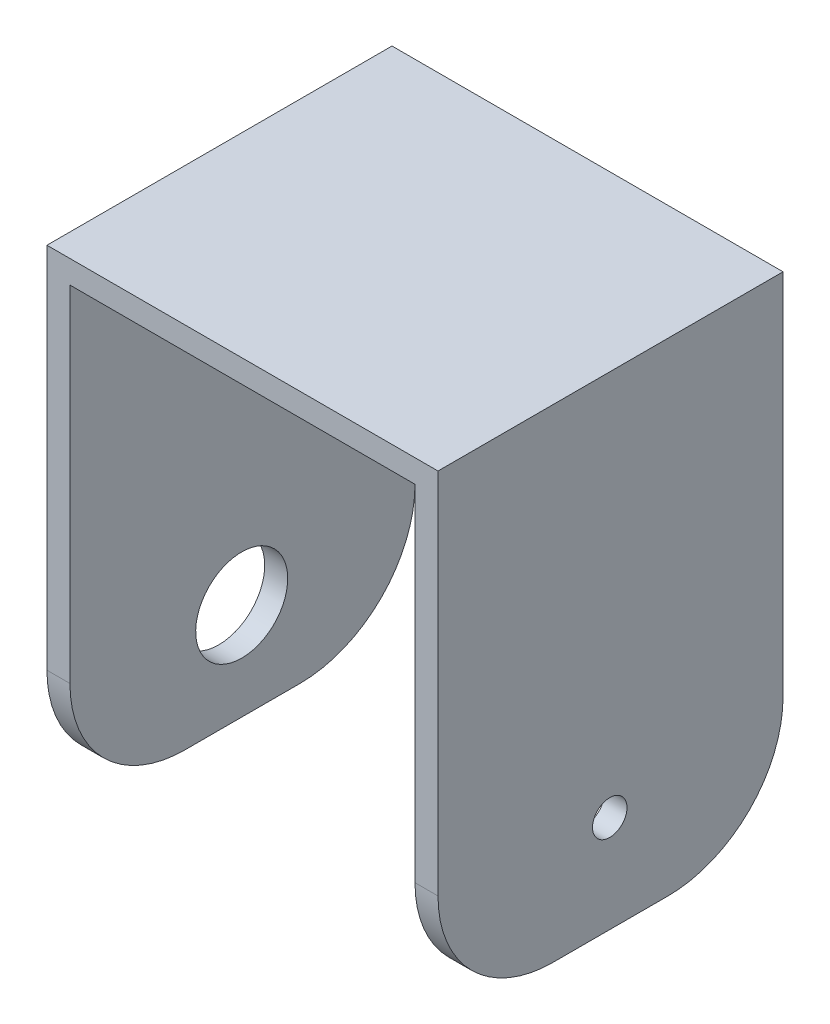
ISO-10303-21;
HEADER;
FILE_DESCRIPTION(('STEP AP214'),'2;1');
FILE_NAME('part.step','',(''),(''),'','','');
FILE_SCHEMA(('AUTOMOTIVE_DESIGN { 1 0 10303 214 1 1 1 1 }'));
ENDSEC;
DATA;
#1=APPLICATION_CONTEXT('core data for automotive mechanical design processes');
#2=APPLICATION_PROTOCOL_DEFINITION('international standard','automotive_design',2000,#1);
#3=PRODUCT_CONTEXT('',#1,'mechanical');
#4=PRODUCT('Part','Part','',(#3));
#5=PRODUCT_RELATED_PRODUCT_CATEGORY('part','',(#4));
#6=PRODUCT_DEFINITION_FORMATION('','',#4);
#7=PRODUCT_DEFINITION_CONTEXT('part definition',#1,'design');
#8=PRODUCT_DEFINITION('design','',#6,#7);
#9=PRODUCT_DEFINITION_SHAPE('','',#8);
#10=(LENGTH_UNIT() NAMED_UNIT(*) SI_UNIT(.MILLI.,.METRE.));
#11=(NAMED_UNIT(*) PLANE_ANGLE_UNIT() SI_UNIT($,.RADIAN.));
#12=(NAMED_UNIT(*) SI_UNIT($,.STERADIAN.) SOLID_ANGLE_UNIT());
#13=UNCERTAINTY_MEASURE_WITH_UNIT(LENGTH_MEASURE(1.E-05),#10,'distance_accuracy_value','');
#14=(GEOMETRIC_REPRESENTATION_CONTEXT(3) GLOBAL_UNCERTAINTY_ASSIGNED_CONTEXT((#13)) GLOBAL_UNIT_ASSIGNED_CONTEXT((#10,
#11,#12)) REPRESENTATION_CONTEXT('',''));
#15=CARTESIAN_POINT('',(0.,0.,0.));
#16=DIRECTION('',(0.,0.,1.));
#17=DIRECTION('',(1.,0.,0.));
#18=AXIS2_PLACEMENT_3D('',#15,#16,#17);
#19=CARTESIAN_POINT('',(0.,0.,30.));
#20=DIRECTION('',(0.,1.,0.));
#21=DIRECTION('',(0.,0.,1.));
#22=AXIS2_PLACEMENT_3D('',#19,#20,#21);
#23=PLANE('',#22);
#24=DIRECTION('',(0.,0.,-1.));
#25=VECTOR('',#24,1.);
#26=CARTESIAN_POINT('',(2.,0.,30.));
#27=LINE('',#26,#25);
#28=CARTESIAN_POINT('',(2.,0.,20.));
#29=VERTEX_POINT('',#28);
#30=CARTESIAN_POINT('',(2.,0.,10.));
#31=VERTEX_POINT('',#30);
#32=EDGE_CURVE('E147',#29,#31,#27,.T.);
#33=ORIENTED_EDGE('',*,*,#32,.F.);
#34=DIRECTION('',(1.,0.,0.));
#35=VECTOR('',#34,1.);
#36=CARTESIAN_POINT('',(0.,0.,20.));
#37=LINE('',#36,#35);
#38=CARTESIAN_POINT('',(0.,0.,20.));
#39=VERTEX_POINT('',#38);
#40=EDGE_CURVE('E219',#29,#39,#37,.F.);
#41=ORIENTED_EDGE('',*,*,#40,.T.);
#42=DIRECTION('',(0.,0.,-1.));
#43=VECTOR('',#42,1.);
#44=CARTESIAN_POINT('',(0.,0.,30.));
#45=LINE('',#44,#43);
#46=CARTESIAN_POINT('',(0.,0.,10.));
#47=VERTEX_POINT('',#46);
#48=EDGE_CURVE('E170',#39,#47,#45,.T.);
#49=ORIENTED_EDGE('',*,*,#48,.T.);
#50=DIRECTION('',(1.,0.,0.));
#51=VECTOR('',#50,1.);
#52=CARTESIAN_POINT('',(0.,0.,10.));
#53=LINE('',#52,#51);
#54=EDGE_CURVE('E220',#47,#31,#53,.T.);
#55=ORIENTED_EDGE('',*,*,#54,.T.);
#56=EDGE_LOOP('',(#33,#41,#49,#55));
#57=FACE_BOUND('',#56,.T.);
#58=ADVANCED_FACE('F39',(#57),#23,.F.);
#59=CARTESIAN_POINT('',(2.,0.,30.));
#60=DIRECTION('',(-1.,0.,0.));
#61=DIRECTION('',(0.,0.,1.));
#62=AXIS2_PLACEMENT_3D('',#59,#60,#61);
#63=PLANE('',#62);
#64=CARTESIAN_POINT('',(2.,8.44012340517832,15.0664421294036));
#65=DIRECTION('',(1.,0.,0.));
#66=DIRECTION('',(0.,0.,-1.));
#67=AXIS2_PLACEMENT_3D('',#64,#65,#66);
#68=CIRCLE('',#67,1.50000000000072);
#69=CARTESIAN_POINT('',(2.,8.44012340517832,13.5664421294028));
#70=VERTEX_POINT('',#69);
#71=EDGE_CURVE('E232',#70,#70,#68,.T.);
#72=ORIENTED_EDGE('',*,*,#71,.F.);
#73=EDGE_LOOP('',(#72));
#74=FACE_BOUND('',#73,.T.);
#75=DIRECTION('',(0.,1.,0.));
#76=VECTOR('',#75,1.);
#77=CARTESIAN_POINT('',(2.,0.,30.));
#78=LINE('',#77,#76);
#79=CARTESIAN_POINT('',(2.,10.,30.));
#80=VERTEX_POINT('',#79);
#81=CARTESIAN_POINT('',(2.,42.,30.));
#82=VERTEX_POINT('',#81);
#83=EDGE_CURVE('E134',#80,#82,#78,.T.);
#84=ORIENTED_EDGE('',*,*,#83,.F.);
#85=CARTESIAN_POINT('',(2.,10.,20.));
#86=DIRECTION('',(-1.,0.,0.));
#87=DIRECTION('',(0.,0.,1.));
#88=AXIS2_PLACEMENT_3D('',#85,#86,#87);
#89=CIRCLE('',#88,10.);
#90=EDGE_CURVE('E214',#80,#29,#89,.F.);
#91=ORIENTED_EDGE('',*,*,#90,.T.);
#92=ORIENTED_EDGE('',*,*,#32,.T.);
#93=CARTESIAN_POINT('',(2.,10.,10.));
#94=DIRECTION('',(-1.,0.,0.));
#95=DIRECTION('',(0.,0.,1.));
#96=AXIS2_PLACEMENT_3D('',#93,#94,#95);
#97=CIRCLE('',#96,10.);
#98=CARTESIAN_POINT('',(2.,10.,0.));
#99=VERTEX_POINT('',#98);
#100=EDGE_CURVE('E213',#31,#99,#97,.F.);
#101=ORIENTED_EDGE('',*,*,#100,.T.);
#102=DIRECTION('',(0.,1.,0.));
#103=VECTOR('',#102,1.);
#104=CARTESIAN_POINT('',(2.,0.,0.));
#105=LINE('',#104,#103);
#106=CARTESIAN_POINT('',(2.,42.,0.));
#107=VERTEX_POINT('',#106);
#108=EDGE_CURVE('E150',#99,#107,#105,.T.);
#109=ORIENTED_EDGE('',*,*,#108,.T.);
#110=DIRECTION('',(0.,0.,-1.));
#111=VECTOR('',#110,1.);
#112=CARTESIAN_POINT('',(2.,42.,30.));
#113=LINE('',#112,#111);
#114=EDGE_CURVE('E144',#82,#107,#113,.T.);
#115=ORIENTED_EDGE('',*,*,#114,.F.);
#116=EDGE_LOOP('',(#84,#91,#92,#101,#109,#115));
#117=FACE_BOUND('',#116,.T.);
#118=ADVANCED_FACE('F148',(#74,#117),#63,.F.);
#119=CARTESIAN_POINT('',(2.,42.,30.));
#120=DIRECTION('',(0.,-1.,0.));
#121=DIRECTION('',(1.,0.,0.));
#122=AXIS2_PLACEMENT_3D('',#119,#120,#121);
#123=PLANE('',#122);
#124=DIRECTION('',(-1.,0.,0.));
#125=VECTOR('',#124,1.);
#126=CARTESIAN_POINT('',(2.,42.,0.));
#127=LINE('',#126,#125);
#128=CARTESIAN_POINT('',(-32.,42.,0.));
#129=VERTEX_POINT('',#128);
#130=EDGE_CURVE('E166',#107,#129,#127,.T.);
#131=ORIENTED_EDGE('',*,*,#130,.T.);
#132=DIRECTION('',(0.,0.,-1.));
#133=VECTOR('',#132,1.);
#134=CARTESIAN_POINT('',(-32.,42.,30.));
#135=LINE('',#134,#133);
#136=CARTESIAN_POINT('',(-32.,42.,30.));
#137=VERTEX_POINT('',#136);
#138=EDGE_CURVE('E151',#137,#129,#135,.T.);
#139=ORIENTED_EDGE('',*,*,#138,.F.);
#140=DIRECTION('',(-1.,0.,0.));
#141=VECTOR('',#140,1.);
#142=CARTESIAN_POINT('',(2.,42.,30.));
#143=LINE('',#142,#141);
#144=EDGE_CURVE('E138',#82,#137,#143,.T.);
#145=ORIENTED_EDGE('',*,*,#144,.F.);
#146=ORIENTED_EDGE('',*,*,#114,.T.);
#147=EDGE_LOOP('',(#131,#139,#145,#146));
#148=FACE_BOUND('',#147,.T.);
#149=ADVANCED_FACE('F153',(#148),#123,.F.);
#150=CARTESIAN_POINT('',(-32.,42.,30.));
#151=DIRECTION('',(1.,0.,0.));
#152=DIRECTION('',(0.,1.,0.));
#153=AXIS2_PLACEMENT_3D('',#150,#151,#152);
#154=PLANE('',#153);
#155=CARTESIAN_POINT('',(-32.,8.44012340517832,15.0664421294036));
#156=DIRECTION('',(-1.,0.,0.));
#157=DIRECTION('',(0.,-1.,0.));
#158=AXIS2_PLACEMENT_3D('',#155,#156,#157);
#159=CIRCLE('',#158,4.);
#160=CARTESIAN_POINT('',(-32.,4.44012340517832,15.0664421294036));
#161=VERTEX_POINT('',#160);
#162=EDGE_CURVE('E229',#161,#161,#159,.T.);
#163=ORIENTED_EDGE('',*,*,#162,.F.);
#164=EDGE_LOOP('',(#163));
#165=FACE_BOUND('',#164,.T.);
#166=DIRECTION('',(0.,0.,-1.));
#167=VECTOR('',#166,1.);
#168=CARTESIAN_POINT('',(-32.,0.,30.));
#169=LINE('',#168,#167);
#170=CARTESIAN_POINT('',(-32.,0.,20.));
#171=VERTEX_POINT('',#170);
#172=CARTESIAN_POINT('',(-32.,0.,10.));
#173=VERTEX_POINT('',#172);
#174=EDGE_CURVE('E187',#171,#173,#169,.T.);
#175=ORIENTED_EDGE('',*,*,#174,.F.);
#176=CARTESIAN_POINT('',(-32.,9.99999999999999,20.));
#177=DIRECTION('',(1.,0.,0.));
#178=DIRECTION('',(0.,1.,0.));
#179=AXIS2_PLACEMENT_3D('',#176,#177,#178);
#180=CIRCLE('',#179,10.);
#181=CARTESIAN_POINT('',(-32.,10.,30.));
#182=VERTEX_POINT('',#181);
#183=EDGE_CURVE('E211',#171,#182,#180,.F.);
#184=ORIENTED_EDGE('',*,*,#183,.T.);
#185=DIRECTION('',(0.,-1.,0.));
#186=VECTOR('',#185,1.);
#187=CARTESIAN_POINT('',(-32.,42.,30.));
#188=LINE('',#187,#186);
#189=EDGE_CURVE('E156',#137,#182,#188,.T.);
#190=ORIENTED_EDGE('',*,*,#189,.F.);
#191=ORIENTED_EDGE('',*,*,#138,.T.);
#192=DIRECTION('',(0.,-1.,0.));
#193=VECTOR('',#192,1.);
#194=CARTESIAN_POINT('',(-32.,42.,0.));
#195=LINE('',#194,#193);
#196=CARTESIAN_POINT('',(-32.,10.,0.));
#197=VERTEX_POINT('',#196);
#198=EDGE_CURVE('E171',#129,#197,#195,.T.);
#199=ORIENTED_EDGE('',*,*,#198,.T.);
#200=CARTESIAN_POINT('',(-32.,9.99999999999999,10.));
#201=DIRECTION('',(1.,0.,0.));
#202=DIRECTION('',(0.,1.,0.));
#203=AXIS2_PLACEMENT_3D('',#200,#201,#202);
#204=CIRCLE('',#203,10.);
#205=EDGE_CURVE('E207',#197,#173,#204,.F.);
#206=ORIENTED_EDGE('',*,*,#205,.T.);
#207=EDGE_LOOP('',(#175,#184,#190,#191,#199,#206));
#208=FACE_BOUND('',#207,.T.);
#209=ADVANCED_FACE('F247',(#165,#208),#154,.F.);
#210=CARTESIAN_POINT('',(-32.,0.,30.));
#211=DIRECTION('',(0.,1.,0.));
#212=DIRECTION('',(0.,0.,1.));
#213=AXIS2_PLACEMENT_3D('',#210,#211,#212);
#214=PLANE('',#213);
#215=DIRECTION('',(0.,0.,-1.));
#216=VECTOR('',#215,1.);
#217=CARTESIAN_POINT('',(-30.,0.,30.));
#218=LINE('',#217,#216);
#219=CARTESIAN_POINT('',(-30.,0.,20.));
#220=VERTEX_POINT('',#219);
#221=CARTESIAN_POINT('',(-30.,0.,10.));
#222=VERTEX_POINT('',#221);
#223=EDGE_CURVE('E186',#220,#222,#218,.T.);
#224=ORIENTED_EDGE('',*,*,#223,.F.);
#225=DIRECTION('',(1.,0.,0.));
#226=VECTOR('',#225,1.);
#227=CARTESIAN_POINT('',(-32.,0.,20.));
#228=LINE('',#227,#226);
#229=EDGE_CURVE('E210',#220,#171,#228,.F.);
#230=ORIENTED_EDGE('',*,*,#229,.T.);
#231=ORIENTED_EDGE('',*,*,#174,.T.);
#232=DIRECTION('',(1.,0.,0.));
#233=VECTOR('',#232,1.);
#234=CARTESIAN_POINT('',(-32.,0.,10.));
#235=LINE('',#234,#233);
#236=EDGE_CURVE('E204',#173,#222,#235,.T.);
#237=ORIENTED_EDGE('',*,*,#236,.T.);
#238=EDGE_LOOP('',(#224,#230,#231,#237));
#239=FACE_BOUND('',#238,.T.);
#240=ADVANCED_FACE('F293',(#239),#214,.F.);
#241=CARTESIAN_POINT('',(-30.,40.,30.));
#242=DIRECTION('',(-1.,0.,0.));
#243=DIRECTION('',(0.,-1.,0.));
#244=AXIS2_PLACEMENT_3D('',#241,#242,#243);
#245=PLANE('',#244);
#246=CARTESIAN_POINT('',(-30.,8.44012340517832,15.0664421294036));
#247=DIRECTION('',(-1.,0.,0.));
#248=DIRECTION('',(0.,-1.,0.));
#249=AXIS2_PLACEMENT_3D('',#246,#247,#248);
#250=CIRCLE('',#249,4.);
#251=CARTESIAN_POINT('',(-30.,4.44012340517832,15.0664421294036));
#252=VERTEX_POINT('',#251);
#253=EDGE_CURVE('E168',#252,#252,#250,.T.);
#254=ORIENTED_EDGE('',*,*,#253,.T.);
#255=EDGE_LOOP('',(#254));
#256=FACE_BOUND('',#255,.T.);
#257=DIRECTION('',(0.,1.,0.));
#258=VECTOR('',#257,1.);
#259=CARTESIAN_POINT('',(-30.,40.,30.));
#260=LINE('',#259,#258);
#261=CARTESIAN_POINT('',(-30.,9.99999999999999,30.));
#262=VERTEX_POINT('',#261);
#263=CARTESIAN_POINT('',(-30.,40.,30.));
#264=VERTEX_POINT('',#263);
#265=EDGE_CURVE('E158',#262,#264,#260,.T.);
#266=ORIENTED_EDGE('',*,*,#265,.F.);
#267=CARTESIAN_POINT('',(-30.,9.99999999999999,20.));
#268=DIRECTION('',(-1.,0.,0.));
#269=DIRECTION('',(0.,-1.,0.));
#270=AXIS2_PLACEMENT_3D('',#267,#268,#269);
#271=CIRCLE('',#270,10.);
#272=EDGE_CURVE('E205',#262,#220,#271,.F.);
#273=ORIENTED_EDGE('',*,*,#272,.T.);
#274=ORIENTED_EDGE('',*,*,#223,.T.);
#275=CARTESIAN_POINT('',(-30.,9.99999999999999,10.));
#276=DIRECTION('',(-1.,0.,0.));
#277=DIRECTION('',(0.,-1.,0.));
#278=AXIS2_PLACEMENT_3D('',#275,#276,#277);
#279=CIRCLE('',#278,10.);
#280=CARTESIAN_POINT('',(-30.,9.99999999999999,0.));
#281=VERTEX_POINT('',#280);
#282=EDGE_CURVE('E199',#222,#281,#279,.F.);
#283=ORIENTED_EDGE('',*,*,#282,.T.);
#284=DIRECTION('',(0.,1.,0.));
#285=VECTOR('',#284,1.);
#286=CARTESIAN_POINT('',(-30.,40.,0.));
#287=LINE('',#286,#285);
#288=CARTESIAN_POINT('',(-30.,40.,0.));
#289=VERTEX_POINT('',#288);
#290=EDGE_CURVE('E172',#281,#289,#287,.T.);
#291=ORIENTED_EDGE('',*,*,#290,.T.);
#292=DIRECTION('',(0.,0.,-1.));
#293=VECTOR('',#292,1.);
#294=CARTESIAN_POINT('',(-30.,40.,30.));
#295=LINE('',#294,#293);
#296=EDGE_CURVE('E184',#264,#289,#295,.T.);
#297=ORIENTED_EDGE('',*,*,#296,.F.);
#298=EDGE_LOOP('',(#266,#273,#274,#283,#291,#297));
#299=FACE_BOUND('',#298,.T.);
#300=ADVANCED_FACE('F300',(#256,#299),#245,.F.);
#301=CARTESIAN_POINT('',(0.,40.,30.));
#302=DIRECTION('',(0.,1.,0.));
#303=DIRECTION('',(-1.,0.,0.));
#304=AXIS2_PLACEMENT_3D('',#301,#302,#303);
#305=PLANE('',#304);
#306=DIRECTION('',(1.,0.,0.));
#307=VECTOR('',#306,1.);
#308=CARTESIAN_POINT('',(0.,40.,0.));
#309=LINE('',#308,#307);
#310=CARTESIAN_POINT('',(0.,40.,0.));
#311=VERTEX_POINT('',#310);
#312=EDGE_CURVE('E179',#289,#311,#309,.T.);
#313=ORIENTED_EDGE('',*,*,#312,.T.);
#314=DIRECTION('',(0.,0.,-1.));
#315=VECTOR('',#314,1.);
#316=CARTESIAN_POINT('',(0.,40.,30.));
#317=LINE('',#316,#315);
#318=CARTESIAN_POINT('',(0.,40.,30.));
#319=VERTEX_POINT('',#318);
#320=EDGE_CURVE('E182',#319,#311,#317,.T.);
#321=ORIENTED_EDGE('',*,*,#320,.F.);
#322=DIRECTION('',(1.,0.,0.));
#323=VECTOR('',#322,1.);
#324=CARTESIAN_POINT('',(0.,40.,30.));
#325=LINE('',#324,#323);
#326=EDGE_CURVE('E162',#264,#319,#325,.T.);
#327=ORIENTED_EDGE('',*,*,#326,.F.);
#328=ORIENTED_EDGE('',*,*,#296,.T.);
#329=EDGE_LOOP('',(#313,#321,#327,#328));
#330=FACE_BOUND('',#329,.T.);
#331=ADVANCED_FACE('F281',(#330),#305,.F.);
#332=CARTESIAN_POINT('',(0.,0.,30.));
#333=DIRECTION('',(1.,0.,0.));
#334=DIRECTION('',(0.,0.,-1.));
#335=AXIS2_PLACEMENT_3D('',#332,#333,#334);
#336=PLANE('',#335);
#337=CARTESIAN_POINT('',(0.,8.44012340517832,15.0664421294036));
#338=DIRECTION('',(1.,0.,0.));
#339=DIRECTION('',(0.,0.,-1.));
#340=AXIS2_PLACEMENT_3D('',#337,#338,#339);
#341=CIRCLE('',#340,1.50000000000072);
#342=CARTESIAN_POINT('',(0.,8.44012340517832,13.5664421294028));
#343=VERTEX_POINT('',#342);
#344=EDGE_CURVE('E43',#343,#343,#341,.T.);
#345=ORIENTED_EDGE('',*,*,#344,.T.);
#346=EDGE_LOOP('',(#345));
#347=FACE_BOUND('',#346,.T.);
#348=ORIENTED_EDGE('',*,*,#48,.F.);
#349=CARTESIAN_POINT('',(0.,10.,20.));
#350=DIRECTION('',(1.,0.,0.));
#351=DIRECTION('',(0.,0.,-1.));
#352=AXIS2_PLACEMENT_3D('',#349,#350,#351);
#353=CIRCLE('',#352,10.);
#354=CARTESIAN_POINT('',(0.,10.,30.));
#355=VERTEX_POINT('',#354);
#356=EDGE_CURVE('E224',#39,#355,#353,.F.);
#357=ORIENTED_EDGE('',*,*,#356,.T.);
#358=DIRECTION('',(0.,-1.,0.));
#359=VECTOR('',#358,1.);
#360=CARTESIAN_POINT('',(0.,0.,30.));
#361=LINE('',#360,#359);
#362=EDGE_CURVE('E164',#319,#355,#361,.T.);
#363=ORIENTED_EDGE('',*,*,#362,.F.);
#364=ORIENTED_EDGE('',*,*,#320,.T.);
#365=DIRECTION('',(0.,-1.,0.));
#366=VECTOR('',#365,1.);
#367=CARTESIAN_POINT('',(0.,0.,0.));
#368=LINE('',#367,#366);
#369=CARTESIAN_POINT('',(0.,10.,0.));
#370=VERTEX_POINT('',#369);
#371=EDGE_CURVE('E142',#311,#370,#368,.T.);
#372=ORIENTED_EDGE('',*,*,#371,.T.);
#373=CARTESIAN_POINT('',(0.,10.,10.));
#374=DIRECTION('',(1.,0.,0.));
#375=DIRECTION('',(0.,0.,-1.));
#376=AXIS2_PLACEMENT_3D('',#373,#374,#375);
#377=CIRCLE('',#376,10.);
#378=EDGE_CURVE('E64',#370,#47,#377,.F.);
#379=ORIENTED_EDGE('',*,*,#378,.T.);
#380=EDGE_LOOP('',(#348,#357,#363,#364,#372,#379));
#381=FACE_BOUND('',#380,.T.);
#382=ADVANCED_FACE('F274',(#347,#381),#336,.F.);
#383=CARTESIAN_POINT('',(0.,0.,30.));
#384=DIRECTION('',(0.,0.,1.));
#385=DIRECTION('',(1.,0.,0.));
#386=AXIS2_PLACEMENT_3D('',#383,#384,#385);
#387=PLANE('',#386);
#388=ORIENTED_EDGE('',*,*,#189,.T.);
#389=DIRECTION('',(1.,0.,0.));
#390=VECTOR('',#389,1.);
#391=CARTESIAN_POINT('',(-30.,9.99999999999999,30.));
#392=LINE('',#391,#390);
#393=EDGE_CURVE('E197',#182,#262,#392,.T.);
#394=ORIENTED_EDGE('',*,*,#393,.T.);
#395=ORIENTED_EDGE('',*,*,#265,.T.);
#396=ORIENTED_EDGE('',*,*,#326,.T.);
#397=ORIENTED_EDGE('',*,*,#362,.T.);
#398=DIRECTION('',(1.,0.,0.));
#399=VECTOR('',#398,1.);
#400=CARTESIAN_POINT('',(2.,10.,30.));
#401=LINE('',#400,#399);
#402=EDGE_CURVE('E136',#355,#80,#401,.T.);
#403=ORIENTED_EDGE('',*,*,#402,.T.);
#404=ORIENTED_EDGE('',*,*,#83,.T.);
#405=ORIENTED_EDGE('',*,*,#144,.T.);
#406=EDGE_LOOP('',(#388,#394,#395,#396,#397,#403,#404,#405));
#407=FACE_BOUND('',#406,.T.);
#408=ADVANCED_FACE('F133',(#407),#387,.T.);
#409=CARTESIAN_POINT('',(0.,0.,0.));
#410=DIRECTION('',(0.,0.,1.));
#411=DIRECTION('',(1.,0.,0.));
#412=AXIS2_PLACEMENT_3D('',#409,#410,#411);
#413=PLANE('',#412);
#414=ORIENTED_EDGE('',*,*,#108,.F.);
#415=DIRECTION('',(1.,0.,0.));
#416=VECTOR('',#415,1.);
#417=CARTESIAN_POINT('',(0.,10.,0.));
#418=LINE('',#417,#416);
#419=EDGE_CURVE('E11',#99,#370,#418,.F.);
#420=ORIENTED_EDGE('',*,*,#419,.T.);
#421=ORIENTED_EDGE('',*,*,#371,.F.);
#422=ORIENTED_EDGE('',*,*,#312,.F.);
#423=ORIENTED_EDGE('',*,*,#290,.F.);
#424=DIRECTION('',(1.,0.,0.));
#425=VECTOR('',#424,1.);
#426=CARTESIAN_POINT('',(0.,9.99999999999999,0.));
#427=LINE('',#426,#425);
#428=EDGE_CURVE('E48',#281,#197,#427,.F.);
#429=ORIENTED_EDGE('',*,*,#428,.T.);
#430=ORIENTED_EDGE('',*,*,#198,.F.);
#431=ORIENTED_EDGE('',*,*,#130,.F.);
#432=EDGE_LOOP('',(#414,#420,#421,#422,#423,#429,#430,#431));
#433=FACE_BOUND('',#432,.T.);
#434=ADVANCED_FACE('F259',(#433),#413,.F.);
#435=CARTESIAN_POINT('',(0.,9.99999999999999,20.));
#436=DIRECTION('',(-1.,0.,0.));
#437=DIRECTION('',(0.,0.,1.));
#438=AXIS2_PLACEMENT_3D('',#435,#436,#437);
#439=CYLINDRICAL_SURFACE('',#438,10.);
#440=ORIENTED_EDGE('',*,*,#183,.F.);
#441=ORIENTED_EDGE('',*,*,#229,.F.);
#442=ORIENTED_EDGE('',*,*,#272,.F.);
#443=ORIENTED_EDGE('',*,*,#393,.F.);
#444=EDGE_LOOP('',(#440,#441,#442,#443));
#445=FACE_BOUND('',#444,.T.);
#446=ADVANCED_FACE('F254',(#445),#439,.T.);
#447=CARTESIAN_POINT('',(0.,10.,20.));
#448=DIRECTION('',(-1.,0.,0.));
#449=DIRECTION('',(0.,0.,1.));
#450=AXIS2_PLACEMENT_3D('',#447,#448,#449);
#451=CYLINDRICAL_SURFACE('',#450,10.);
#452=ORIENTED_EDGE('',*,*,#356,.F.);
#453=ORIENTED_EDGE('',*,*,#40,.F.);
#454=ORIENTED_EDGE('',*,*,#90,.F.);
#455=ORIENTED_EDGE('',*,*,#402,.F.);
#456=EDGE_LOOP('',(#452,#453,#454,#455));
#457=FACE_BOUND('',#456,.T.);
#458=ADVANCED_FACE('F256',(#457),#451,.T.);
#459=CARTESIAN_POINT('',(0.,10.,10.));
#460=DIRECTION('',(1.,0.,0.));
#461=DIRECTION('',(0.,0.,-1.));
#462=AXIS2_PLACEMENT_3D('',#459,#460,#461);
#463=CYLINDRICAL_SURFACE('',#462,10.);
#464=ORIENTED_EDGE('',*,*,#378,.F.);
#465=ORIENTED_EDGE('',*,*,#419,.F.);
#466=ORIENTED_EDGE('',*,*,#100,.F.);
#467=ORIENTED_EDGE('',*,*,#54,.F.);
#468=EDGE_LOOP('',(#464,#465,#466,#467));
#469=FACE_BOUND('',#468,.T.);
#470=ADVANCED_FACE('F265',(#469),#463,.T.);
#471=CARTESIAN_POINT('',(-32.,9.99999999999999,10.));
#472=DIRECTION('',(1.,0.,0.));
#473=DIRECTION('',(0.,0.,-1.));
#474=AXIS2_PLACEMENT_3D('',#471,#472,#473);
#475=CYLINDRICAL_SURFACE('',#474,10.);
#476=ORIENTED_EDGE('',*,*,#205,.F.);
#477=ORIENTED_EDGE('',*,*,#428,.F.);
#478=ORIENTED_EDGE('',*,*,#282,.F.);
#479=ORIENTED_EDGE('',*,*,#236,.F.);
#480=EDGE_LOOP('',(#476,#477,#478,#479));
#481=FACE_BOUND('',#480,.T.);
#482=ADVANCED_FACE('F41',(#481),#475,.T.);
#483=CARTESIAN_POINT('',(-29.,8.44012340517832,15.0664421294036));
#484=DIRECTION('',(-1.,0.,0.));
#485=DIRECTION('',(0.,-1.,0.));
#486=AXIS2_PLACEMENT_3D('',#483,#484,#485);
#487=CYLINDRICAL_SURFACE('',#486,4.);
#488=ORIENTED_EDGE('',*,*,#162,.T.);
#489=EDGE_LOOP('',(#488));
#490=FACE_BOUND('',#489,.T.);
#491=ORIENTED_EDGE('',*,*,#253,.F.);
#492=EDGE_LOOP('',(#491));
#493=FACE_BOUND('',#492,.T.);
#494=ADVANCED_FACE('F267',(#490,#493),#487,.F.);
#495=CARTESIAN_POINT('',(-1.,8.44012340517832,15.0664421294036));
#496=DIRECTION('',(1.,0.,0.));
#497=DIRECTION('',(0.,0.,-1.));
#498=AXIS2_PLACEMENT_3D('',#495,#496,#497);
#499=CYLINDRICAL_SURFACE('',#498,1.50000000000072);
#500=ORIENTED_EDGE('',*,*,#71,.T.);
#501=EDGE_LOOP('',(#500));
#502=FACE_BOUND('',#501,.T.);
#503=ORIENTED_EDGE('',*,*,#344,.F.);
#504=EDGE_LOOP('',(#503));
#505=FACE_BOUND('',#504,.T.);
#506=ADVANCED_FACE('F236',(#502,#505),#499,.F.);
#507=CLOSED_SHELL('',(#58,#118,#149,#209,#240,#300,#331,#382,#408,#434,#446,#458,#470,#482,#494,#506));
#508=MANIFOLD_SOLID_BREP('B2',#507);
#509=ADVANCED_BREP_SHAPE_REPRESENTATION('',(#18,#508),#14);
#510=SHAPE_DEFINITION_REPRESENTATION(#9,#509);
ENDSEC;
END-ISO-10303-21;
